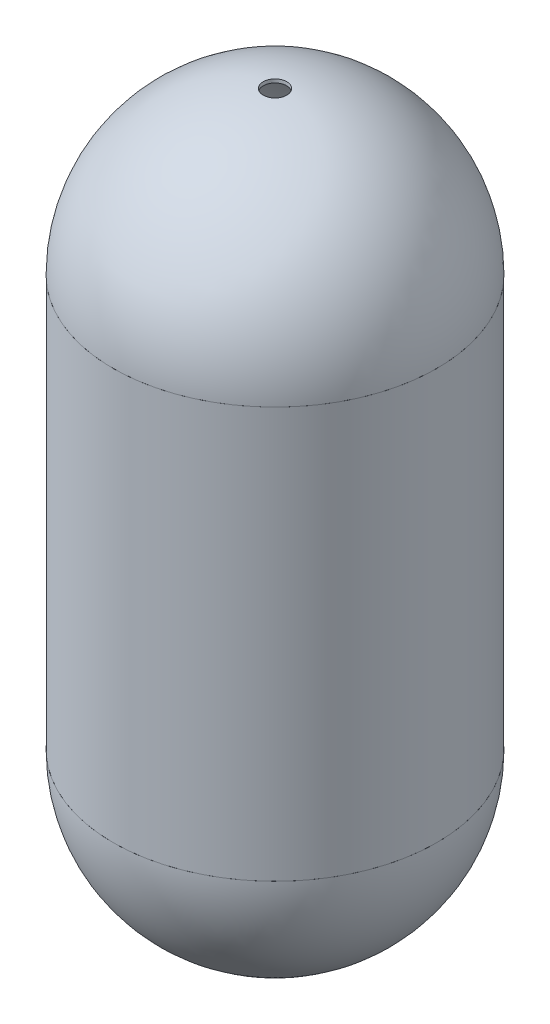
ISO-10303-21;
HEADER;
FILE_DESCRIPTION(('STEP AP214'),'2;1');
FILE_NAME('part.step','',(''),(''),'','','');
FILE_SCHEMA(('AUTOMOTIVE_DESIGN { 1 0 10303 214 1 1 1 1 }'));
ENDSEC;
DATA;
#1=APPLICATION_CONTEXT('core data for automotive mechanical design processes');
#2=APPLICATION_PROTOCOL_DEFINITION('international standard','automotive_design',2000,#1);
#3=PRODUCT_CONTEXT('',#1,'mechanical');
#4=PRODUCT('Part','Part','',(#3));
#5=PRODUCT_RELATED_PRODUCT_CATEGORY('part','',(#4));
#6=PRODUCT_DEFINITION_FORMATION('','',#4);
#7=PRODUCT_DEFINITION_CONTEXT('part definition',#1,'design');
#8=PRODUCT_DEFINITION('design','',#6,#7);
#9=PRODUCT_DEFINITION_SHAPE('','',#8);
#10=(LENGTH_UNIT() NAMED_UNIT(*) SI_UNIT(.MILLI.,.METRE.));
#11=(NAMED_UNIT(*) PLANE_ANGLE_UNIT() SI_UNIT($,.RADIAN.));
#12=(NAMED_UNIT(*) SI_UNIT($,.STERADIAN.) SOLID_ANGLE_UNIT());
#13=UNCERTAINTY_MEASURE_WITH_UNIT(LENGTH_MEASURE(1.E-05),#10,'distance_accuracy_value','');
#14=(GEOMETRIC_REPRESENTATION_CONTEXT(3) GLOBAL_UNCERTAINTY_ASSIGNED_CONTEXT((#13)) GLOBAL_UNIT_ASSIGNED_CONTEXT((#10,
#11,#12)) REPRESENTATION_CONTEXT('',''));
#15=CARTESIAN_POINT('',(0.,0.,0.));
#16=DIRECTION('',(0.,0.,1.));
#17=DIRECTION('',(1.,0.,0.));
#18=AXIS2_PLACEMENT_3D('',#15,#16,#17);
#19=CARTESIAN_POINT('',(0.,656.25,0.));
#20=DIRECTION('',(-0.87529345214149,0.,-0.483592155269533));
#21=DIRECTION('',(0.483592155269533,0.,-0.875293452141491));
#22=AXIS2_PLACEMENT_3D('',#19,#20,#21);
#23=SPHERICAL_SURFACE('',#22,517.5);
#24=CARTESIAN_POINT('',(0.,656.25,0.));
#25=DIRECTION('',(0.,-1.,0.));
#26=DIRECTION('',(-0.483592155269534,0.,0.87529345214149));
#27=AXIS2_PLACEMENT_3D('',#24,#25,#26);
#28=SPHERICAL_SURFACE('',#27,517.5);
#29=CARTESIAN_POINT('',(1.83809291443164E-12,1172.38951602256,-3.33908867480559E-12));
#30=DIRECTION('',(0.,-1.,0.));
#31=DIRECTION('',(-0.483592155269534,0.,0.87529345214149));
#32=AXIS2_PLACEMENT_3D('',#29,#30,#31);
#33=CIRCLE('',#32,37.5);
#34=CARTESIAN_POINT('',(18.1347058226093,1172.38951602256,-32.8235044553092));
#35=VERTEX_POINT('',#34);
#36=EDGE_CURVE('E60',#35,#35,#33,.T.);
#37=ORIENTED_EDGE('',*,*,#36,.T.);
#38=EDGE_LOOP('',(#37));
#39=FACE_BOUND('',#38,.T.);
#40=CARTESIAN_POINT('',(0.,656.25,0.));
#41=DIRECTION('',(0.,-1.,0.));
#42=DIRECTION('',(-0.483592155269533,0.,0.875293452141491));
#43=AXIS2_PLACEMENT_3D('',#40,#41,#42);
#44=CIRCLE('',#43,517.5);
#45=CARTESIAN_POINT('',(-250.258940351983,656.25,452.964361483221));
#46=VERTEX_POINT('',#45);
#47=EDGE_CURVE('E56',#46,#46,#44,.T.);
#48=ORIENTED_EDGE('',*,*,#47,.F.);
#49=EDGE_LOOP('',(#48));
#50=FACE_BOUND('',#49,.T.);
#51=ADVANCED_FACE('F48',(#39,#50),#28,.T.);
#52=CARTESIAN_POINT('',(0.,656.25,0.));
#53=DIRECTION('',(-0.87529345214149,0.,-0.483592155269533));
#54=DIRECTION('',(0.483592155269533,0.,-0.875293452141491));
#55=AXIS2_PLACEMENT_3D('',#52,#53,#54);
#56=SPHERICAL_SURFACE('',#55,506.25);
#57=CARTESIAN_POINT('',(0.,656.25,0.));
#58=DIRECTION('',(0.,-1.,0.));
#59=DIRECTION('',(-0.483592155269534,0.,0.87529345214149));
#60=AXIS2_PLACEMENT_3D('',#57,#58,#59);
#61=SPHERICAL_SURFACE('',#60,506.25);
#62=CARTESIAN_POINT('',(1.8000542477594E-12,1161.10920066886,-3.2702085127367E-12));
#63=DIRECTION('',(0.,-1.,0.));
#64=DIRECTION('',(-0.483592155269534,0.,0.87529345214149));
#65=AXIS2_PLACEMENT_3D('',#62,#63,#64);
#66=CIRCLE('',#65,37.5);
#67=CARTESIAN_POINT('',(18.1347058226093,1161.10920066886,-32.8235044553092));
#68=VERTEX_POINT('',#67);
#69=EDGE_CURVE('E52',#68,#68,#66,.F.);
#70=ORIENTED_EDGE('',*,*,#69,.T.);
#71=EDGE_LOOP('',(#70));
#72=FACE_BOUND('',#71,.T.);
#73=CARTESIAN_POINT('',(0.,656.25,0.));
#74=DIRECTION('',(0.,1.,0.));
#75=DIRECTION('',(-0.483592155269533,0.,0.875293452141491));
#76=AXIS2_PLACEMENT_3D('',#73,#74,#75);
#77=CIRCLE('',#76,506.25);
#78=CARTESIAN_POINT('',(-244.818528605201,656.25,443.11731014663));
#79=VERTEX_POINT('',#78);
#80=EDGE_CURVE('E11',#79,#79,#77,.T.);
#81=ORIENTED_EDGE('',*,*,#80,.F.);
#82=EDGE_LOOP('',(#81));
#83=FACE_BOUND('',#82,.T.);
#84=ADVANCED_FACE('F50',(#72,#83),#61,.F.);
#85=CARTESIAN_POINT('',(0.,656.25,0.));
#86=DIRECTION('',(0.,-1.,0.));
#87=DIRECTION('',(-0.483592155269533,0.,0.875293452141491));
#88=AXIS2_PLACEMENT_3D('',#85,#86,#87);
#89=PLANE('',#88);
#90=ORIENTED_EDGE('',*,*,#80,.T.);
#91=EDGE_LOOP('',(#90));
#92=FACE_BOUND('',#91,.T.);
#93=ORIENTED_EDGE('',*,*,#47,.T.);
#94=EDGE_LOOP('',(#93));
#95=FACE_BOUND('',#94,.T.);
#96=ADVANCED_FACE('F74',(#92,#95),#89,.T.);
#97=CARTESIAN_POINT('',(0.,656.249991,-1.87423759510345E-13));
#98=DIRECTION('',(0.,1.,0.));
#99=DIRECTION('',(0.483592155269534,0.,-0.87529345214149));
#100=AXIS2_PLACEMENT_3D('',#97,#98,#99);
#101=CYLINDRICAL_SURFACE('',#100,37.5);
#102=CARTESIAN_POINT('',(18.1347058226093,1161.10920066886,-32.8235044553092));
#103=CARTESIAN_POINT('',(18.1347058226093,1161.22670395379,-32.8235044553092));
#104=CARTESIAN_POINT('',(18.1347058226093,1161.34420723873,-32.8235044553092));
#105=CARTESIAN_POINT('',(18.1347058226093,1161.5792138086,-32.8235044553092));
#106=CARTESIAN_POINT('',(18.1347058226093,1161.69671709353,-32.8235044553092));
#107=CARTESIAN_POINT('',(18.1347058226093,1161.9317236634,-32.8235044553092));
#108=CARTESIAN_POINT('',(18.1347058226093,1162.04922694833,-32.8235044553092));
#109=CARTESIAN_POINT('',(18.1347058226093,1162.2842335182,-32.8235044553092));
#110=CARTESIAN_POINT('',(18.1347058226093,1162.40173680314,-32.8235044553092));
#111=CARTESIAN_POINT('',(18.1347058226093,1162.63674337301,-32.8235044553092));
#112=CARTESIAN_POINT('',(18.1347058226093,1162.75424665794,-32.8235044553092));
#113=CARTESIAN_POINT('',(18.1347058226093,1162.98925322781,-32.8235044553092));
#114=CARTESIAN_POINT('',(18.1347058226093,1163.10675651274,-32.8235044553092));
#115=CARTESIAN_POINT('',(18.1347058226093,1163.34176308261,-32.8235044553092));
#116=CARTESIAN_POINT('',(18.1347058226093,1163.45926636755,-32.8235044553092));
#117=CARTESIAN_POINT('',(18.1347058226093,1163.69427293742,-32.8235044553092));
#118=CARTESIAN_POINT('',(18.1347058226093,1163.81177622235,-32.8235044553092));
#119=CARTESIAN_POINT('',(18.1347058226093,1164.04678279222,-32.8235044553092));
#120=CARTESIAN_POINT('',(18.1347058226093,1164.16428607715,-32.8235044553092));
#121=CARTESIAN_POINT('',(18.1347058226093,1164.39929264702,-32.8235044553092));
#122=CARTESIAN_POINT('',(18.1347058226093,1164.51679593196,-32.8235044553092));
#123=CARTESIAN_POINT('',(18.1347058226093,1164.75180250182,-32.8235044553092));
#124=CARTESIAN_POINT('',(18.1347058226093,1164.86930578676,-32.8235044553092));
#125=CARTESIAN_POINT('',(18.1347058226093,1165.10431235663,-32.8235044553092));
#126=CARTESIAN_POINT('',(18.1347058226093,1165.22181564156,-32.8235044553092));
#127=CARTESIAN_POINT('',(18.1347058226093,1165.45682221143,-32.8235044553092));
#128=CARTESIAN_POINT('',(18.1347058226093,1165.57432549637,-32.8235044553092));
#129=CARTESIAN_POINT('',(18.1347058226093,1165.80933206623,-32.8235044553092));
#130=CARTESIAN_POINT('',(18.1347058226093,1165.92683535117,-32.8235044553092));
#131=CARTESIAN_POINT('',(18.1347058226093,1166.16184192104,-32.8235044553092));
#132=CARTESIAN_POINT('',(18.1347058226093,1166.27934520597,-32.8235044553092));
#133=CARTESIAN_POINT('',(18.1347058226093,1166.51435177584,-32.8235044553092));
#134=CARTESIAN_POINT('',(18.1347058226093,1166.63185506077,-32.8235044553092));
#135=CARTESIAN_POINT('',(18.1347058226093,1166.86686163064,-32.8235044553092));
#136=CARTESIAN_POINT('',(18.1347058226093,1166.98436491558,-32.8235044553092));
#137=CARTESIAN_POINT('',(18.1347058226093,1167.21937148545,-32.8235044553092));
#138=CARTESIAN_POINT('',(18.1347058226093,1167.33687477038,-32.8235044553092));
#139=CARTESIAN_POINT('',(18.1347058226093,1167.57188134025,-32.8235044553092));
#140=CARTESIAN_POINT('',(18.1347058226093,1167.68938462518,-32.8235044553092));
#141=CARTESIAN_POINT('',(18.1347058226093,1167.92439119505,-32.8235044553092));
#142=CARTESIAN_POINT('',(18.1347058226093,1168.04189447999,-32.8235044553092));
#143=CARTESIAN_POINT('',(18.1347058226093,1168.27690104986,-32.8235044553092));
#144=CARTESIAN_POINT('',(18.1347058226093,1168.39440433479,-32.8235044553092));
#145=CARTESIAN_POINT('',(18.1347058226093,1168.62941090466,-32.8235044553092));
#146=CARTESIAN_POINT('',(18.1347058226093,1168.74691418959,-32.8235044553092));
#147=CARTESIAN_POINT('',(18.1347058226093,1168.98192075946,-32.8235044553092));
#148=CARTESIAN_POINT('',(18.1347058226093,1169.0994240444,-32.8235044553092));
#149=CARTESIAN_POINT('',(18.1347058226093,1169.33443061426,-32.8235044553092));
#150=CARTESIAN_POINT('',(18.1347058226093,1169.4519338992,-32.8235044553092));
#151=CARTESIAN_POINT('',(18.1347058226093,1169.68694046907,-32.8235044553092));
#152=CARTESIAN_POINT('',(18.1347058226093,1169.804443754,-32.8235044553092));
#153=CARTESIAN_POINT('',(18.1347058226093,1170.03945032387,-32.8235044553092));
#154=CARTESIAN_POINT('',(18.1347058226093,1170.1569536088,-32.8235044553092));
#155=CARTESIAN_POINT('',(18.1347058226093,1170.39196017867,-32.8235044553092));
#156=CARTESIAN_POINT('',(18.1347058226093,1170.50946346361,-32.8235044553092));
#157=CARTESIAN_POINT('',(18.1347058226093,1170.74447003348,-32.8235044553092));
#158=CARTESIAN_POINT('',(18.1347058226093,1170.86197331841,-32.8235044553092));
#159=CARTESIAN_POINT('',(18.1347058226093,1171.09697988828,-32.8235044553092));
#160=CARTESIAN_POINT('',(18.1347058226093,1171.21448317321,-32.8235044553092));
#161=CARTESIAN_POINT('',(18.1347058226093,1171.44948974308,-32.8235044553092));
#162=CARTESIAN_POINT('',(18.1347058226093,1171.56699302802,-32.8235044553092));
#163=CARTESIAN_POINT('',(18.1347058226093,1171.80199959789,-32.8235044553092));
#164=CARTESIAN_POINT('',(18.1347058226093,1171.91950288282,-32.8235044553092));
#165=CARTESIAN_POINT('',(18.1347058226093,1172.15450945269,-32.8235044553092));
#166=CARTESIAN_POINT('',(18.1347058226093,1172.27201273762,-32.8235044553092));
#167=CARTESIAN_POINT('',(18.1347058226093,1172.38951602256,-32.8235044553092));
#168=B_SPLINE_CURVE_WITH_KNOTS('',3,(#102,#103,#104,#105,#106,#107,#108,#109,#110,#111,#112,
#113,#114,#115,#116,#117,#118,#119,#120,#121,#122,#123,#124,#125,#126,#127,#128,#129,#130,#131,
#132,#133,#134,#135,#136,#137,#138,#139,#140,#141,#142,#143,#144,#145,#146,#147,#148,#149,#150,
#151,#152,#153,#154,#155,#156,#157,#158,#159,#160,#161,#162,#163,#164,#165,#166,#167),
.UNSPECIFIED.,.F.,.F.,(4,2,2,2,2,2,2,2,2,2,2,2,2,2,2,2,2,2,2,2,2,2,2,2,2,2,2,2,2,2,2,2,4),(0.,
0.352509854802951,0.705019709606125,1.0575295644093,1.41003941921225,1.7625492740152,
2.11505912881838,2.46756898362133,2.82007883842428,3.17258869322745,3.52509854803063,
3.87760840283358,4.23011825763653,4.5826281124397,4.93513796724265,5.2876478220456,
5.64015767684878,5.99266753165195,6.3451773864549,6.69768724125785,7.05019709606103,
7.40270695086398,7.75521680566693,8.1077266604701,8.46023651527328,8.81274637007623,
9.16525622487918,9.51776607968235,9.87027593448531,10.2227857892883,10.5752956440914,
10.9278054988946,11.2803153536976),.UNSPECIFIED.);
#169=EDGE_CURVE('BSEAM71',#68,#35,#168,.T.);
#170=ORIENTED_EDGE('',*,*,#69,.F.);
#171=ORIENTED_EDGE('',*,*,#36,.F.);
#172=ORIENTED_EDGE('',*,*,#169,.T.);
#173=ORIENTED_EDGE('',*,*,#169,.F.);
#174=EDGE_LOOP('',(#170,#172,#171,#173));
#175=FACE_BOUND('',#174,.T.);
#176=ADVANCED_FACE('F71',(#175),#101,.F.);
#177=CLOSED_SHELL('',(#51,#84,#96,#176));
#178=MANIFOLD_SOLID_BREP('B2',#177);
#179=CARTESIAN_POINT('',(0.,-656.25,0.));
#180=DIRECTION('',(-0.145123773166015,0.,0.98941350832807));
#181=DIRECTION('',(0.98941350832807,0.,0.145123773166015));
#182=AXIS2_PLACEMENT_3D('',#179,#180,#181);
#183=SPHERICAL_SURFACE('',#182,517.5);
#184=CARTESIAN_POINT('',(0.,-656.25,0.));
#185=DIRECTION('',(0.,1.,0.));
#186=DIRECTION('',(-0.98941350832807,0.,-0.145123773166014));
#187=AXIS2_PLACEMENT_3D('',#184,#185,#186);
#188=SPHERICAL_SURFACE('',#187,517.5);
#189=CARTESIAN_POINT('',(3.77324272926284E-12,-1172.38951602256,5.59144233357373E-13));
#190=DIRECTION('',(0.,1.,0.));
#191=DIRECTION('',(-0.98941350832807,0.,-0.145123773166014));
#192=AXIS2_PLACEMENT_3D('',#189,#190,#191);
#193=CIRCLE('',#192,37.5);
#194=CARTESIAN_POINT('',(37.1030065623064,-1172.38951602256,5.4421414937261));
#195=VERTEX_POINT('',#194);
#196=EDGE_CURVE('E137',#195,#195,#193,.T.);
#197=ORIENTED_EDGE('',*,*,#196,.T.);
#198=EDGE_LOOP('',(#197));
#199=FACE_BOUND('',#198,.T.);
#200=CARTESIAN_POINT('',(0.,-656.25,0.));
#201=DIRECTION('',(0.,1.,0.));
#202=DIRECTION('',(-0.98941350832807,0.,-0.145123773166015));
#203=AXIS2_PLACEMENT_3D('',#200,#201,#202);
#204=CIRCLE('',#203,517.5);
#205=CARTESIAN_POINT('',(-512.021490559776,-656.25,-75.1015526134127));
#206=VERTEX_POINT('',#205);
#207=EDGE_CURVE('E133',#206,#206,#204,.T.);
#208=ORIENTED_EDGE('',*,*,#207,.F.);
#209=EDGE_LOOP('',(#208));
#210=FACE_BOUND('',#209,.T.);
#211=ADVANCED_FACE('F125',(#199,#210),#188,.T.);
#212=CARTESIAN_POINT('',(0.,-656.25,0.));
#213=DIRECTION('',(-0.145123773166015,0.,0.98941350832807));
#214=DIRECTION('',(0.98941350832807,0.,0.145123773166015));
#215=AXIS2_PLACEMENT_3D('',#212,#213,#214);
#216=SPHERICAL_SURFACE('',#215,506.25);
#217=CARTESIAN_POINT('',(0.,-656.25,0.));
#218=DIRECTION('',(0.,1.,0.));
#219=DIRECTION('',(-0.98941350832807,0.,-0.145123773166014));
#220=AXIS2_PLACEMENT_3D('',#217,#218,#219);
#221=SPHERICAL_SURFACE('',#220,506.25);
#222=CARTESIAN_POINT('',(3.69532943417054E-12,-1161.10920066886,5.47706604172922E-13));
#223=DIRECTION('',(0.,1.,0.));
#224=DIRECTION('',(-0.98941350832807,0.,-0.145123773166014));
#225=AXIS2_PLACEMENT_3D('',#222,#223,#224);
#226=CIRCLE('',#225,37.5);
#227=CARTESIAN_POINT('',(37.1030065623063,-1161.10920066886,5.44214149372609));
#228=VERTEX_POINT('',#227);
#229=EDGE_CURVE('E129',#228,#228,#226,.F.);
#230=ORIENTED_EDGE('',*,*,#229,.T.);
#231=EDGE_LOOP('',(#230));
#232=FACE_BOUND('',#231,.T.);
#233=CARTESIAN_POINT('',(0.,-656.25,0.));
#234=DIRECTION('',(0.,-1.,0.));
#235=DIRECTION('',(-0.98941350832807,0.,-0.145123773166015));
#236=AXIS2_PLACEMENT_3D('',#233,#234,#235);
#237=CIRCLE('',#236,506.25);
#238=CARTESIAN_POINT('',(-500.890588591085,-656.25,-73.468910165295));
#239=VERTEX_POINT('',#238);
#240=EDGE_CURVE('E47',#239,#239,#237,.T.);
#241=ORIENTED_EDGE('',*,*,#240,.F.);
#242=EDGE_LOOP('',(#241));
#243=FACE_BOUND('',#242,.T.);
#244=ADVANCED_FACE('F127',(#232,#243),#221,.F.);
#245=CARTESIAN_POINT('',(0.,-656.25,0.));
#246=DIRECTION('',(0.,1.,0.));
#247=DIRECTION('',(-0.98941350832807,0.,-0.145123773166015));
#248=AXIS2_PLACEMENT_3D('',#245,#246,#247);
#249=PLANE('',#248);
#250=ORIENTED_EDGE('',*,*,#240,.T.);
#251=EDGE_LOOP('',(#250));
#252=FACE_BOUND('',#251,.T.);
#253=ORIENTED_EDGE('',*,*,#207,.T.);
#254=EDGE_LOOP('',(#253));
#255=FACE_BOUND('',#254,.T.);
#256=ADVANCED_FACE('F151',(#252,#255),#249,.T.);
#257=CARTESIAN_POINT('',(2.08259848824405E-13,-656.249991,0.));
#258=DIRECTION('',(0.,-1.,0.));
#259=DIRECTION('',(0.98941350832807,0.,0.145123773166014));
#260=AXIS2_PLACEMENT_3D('',#257,#258,#259);
#261=CYLINDRICAL_SURFACE('',#260,37.5);
#262=CARTESIAN_POINT('',(37.1030065623063,-1161.10920066886,5.44214149372609));
#263=CARTESIAN_POINT('',(37.1030065623063,-1161.22670395379,5.44214149372609));
#264=CARTESIAN_POINT('',(37.1030065623063,-1161.34420723873,5.44214149372609));
#265=CARTESIAN_POINT('',(37.1030065623063,-1161.5792138086,5.44214149372609));
#266=CARTESIAN_POINT('',(37.1030065623063,-1161.69671709353,5.44214149372609));
#267=CARTESIAN_POINT('',(37.1030065623063,-1161.9317236634,5.44214149372609));
#268=CARTESIAN_POINT('',(37.1030065623063,-1162.04922694833,5.44214149372609));
#269=CARTESIAN_POINT('',(37.1030065623063,-1162.2842335182,5.44214149372609));
#270=CARTESIAN_POINT('',(37.1030065623063,-1162.40173680314,5.44214149372609));
#271=CARTESIAN_POINT('',(37.1030065623063,-1162.63674337301,5.44214149372609));
#272=CARTESIAN_POINT('',(37.1030065623063,-1162.75424665794,5.44214149372609));
#273=CARTESIAN_POINT('',(37.1030065623063,-1162.98925322781,5.44214149372609));
#274=CARTESIAN_POINT('',(37.1030065623063,-1163.10675651274,5.44214149372609));
#275=CARTESIAN_POINT('',(37.1030065623063,-1163.34176308261,5.44214149372609));
#276=CARTESIAN_POINT('',(37.1030065623063,-1163.45926636755,5.44214149372609));
#277=CARTESIAN_POINT('',(37.1030065623063,-1163.69427293742,5.44214149372609));
#278=CARTESIAN_POINT('',(37.1030065623063,-1163.81177622235,5.44214149372609));
#279=CARTESIAN_POINT('',(37.1030065623063,-1164.04678279222,5.44214149372609));
#280=CARTESIAN_POINT('',(37.1030065623063,-1164.16428607715,5.44214149372609));
#281=CARTESIAN_POINT('',(37.1030065623063,-1164.39929264702,5.44214149372609));
#282=CARTESIAN_POINT('',(37.1030065623063,-1164.51679593196,5.44214149372609));
#283=CARTESIAN_POINT('',(37.1030065623063,-1164.75180250182,5.44214149372609));
#284=CARTESIAN_POINT('',(37.1030065623063,-1164.86930578676,5.4421414937261));
#285=CARTESIAN_POINT('',(37.1030065623063,-1165.10431235663,5.4421414937261));
#286=CARTESIAN_POINT('',(37.1030065623063,-1165.22181564156,5.4421414937261));
#287=CARTESIAN_POINT('',(37.1030065623063,-1165.45682221143,5.4421414937261));
#288=CARTESIAN_POINT('',(37.1030065623063,-1165.57432549636,5.4421414937261));
#289=CARTESIAN_POINT('',(37.1030065623063,-1165.80933206623,5.4421414937261));
#290=CARTESIAN_POINT('',(37.1030065623063,-1165.92683535117,5.4421414937261));
#291=CARTESIAN_POINT('',(37.1030065623063,-1166.16184192104,5.4421414937261));
#292=CARTESIAN_POINT('',(37.1030065623064,-1166.27934520597,5.4421414937261));
#293=CARTESIAN_POINT('',(37.1030065623064,-1166.51435177584,5.4421414937261));
#294=CARTESIAN_POINT('',(37.1030065623064,-1166.63185506077,5.4421414937261));
#295=CARTESIAN_POINT('',(37.1030065623064,-1166.86686163064,5.4421414937261));
#296=CARTESIAN_POINT('',(37.1030065623064,-1166.98436491558,5.4421414937261));
#297=CARTESIAN_POINT('',(37.1030065623064,-1167.21937148545,5.4421414937261));
#298=CARTESIAN_POINT('',(37.1030065623064,-1167.33687477038,5.4421414937261));
#299=CARTESIAN_POINT('',(37.1030065623064,-1167.57188134025,5.4421414937261));
#300=CARTESIAN_POINT('',(37.1030065623064,-1167.68938462518,5.4421414937261));
#301=CARTESIAN_POINT('',(37.1030065623064,-1167.92439119505,5.4421414937261));
#302=CARTESIAN_POINT('',(37.1030065623064,-1168.04189447999,5.4421414937261));
#303=CARTESIAN_POINT('',(37.1030065623064,-1168.27690104985,5.4421414937261));
#304=CARTESIAN_POINT('',(37.1030065623064,-1168.39440433479,5.4421414937261));
#305=CARTESIAN_POINT('',(37.1030065623064,-1168.62941090466,5.4421414937261));
#306=CARTESIAN_POINT('',(37.1030065623064,-1168.74691418959,5.4421414937261));
#307=CARTESIAN_POINT('',(37.1030065623064,-1168.98192075946,5.4421414937261));
#308=CARTESIAN_POINT('',(37.1030065623064,-1169.0994240444,5.4421414937261));
#309=CARTESIAN_POINT('',(37.1030065623064,-1169.33443061426,5.4421414937261));
#310=CARTESIAN_POINT('',(37.1030065623064,-1169.4519338992,5.4421414937261));
#311=CARTESIAN_POINT('',(37.1030065623064,-1169.68694046907,5.4421414937261));
#312=CARTESIAN_POINT('',(37.1030065623064,-1169.804443754,5.4421414937261));
#313=CARTESIAN_POINT('',(37.1030065623064,-1170.03945032387,5.4421414937261));
#314=CARTESIAN_POINT('',(37.1030065623064,-1170.1569536088,5.4421414937261));
#315=CARTESIAN_POINT('',(37.1030065623064,-1170.39196017867,5.4421414937261));
#316=CARTESIAN_POINT('',(37.1030065623064,-1170.50946346361,5.4421414937261));
#317=CARTESIAN_POINT('',(37.1030065623064,-1170.74447003348,5.4421414937261));
#318=CARTESIAN_POINT('',(37.1030065623064,-1170.86197331841,5.4421414937261));
#319=CARTESIAN_POINT('',(37.1030065623064,-1171.09697988828,5.4421414937261));
#320=CARTESIAN_POINT('',(37.1030065623064,-1171.21448317321,5.4421414937261));
#321=CARTESIAN_POINT('',(37.1030065623064,-1171.44948974308,5.4421414937261));
#322=CARTESIAN_POINT('',(37.1030065623064,-1171.56699302802,5.4421414937261));
#323=CARTESIAN_POINT('',(37.1030065623064,-1171.80199959789,5.4421414937261));
#324=CARTESIAN_POINT('',(37.1030065623064,-1171.91950288282,5.4421414937261));
#325=CARTESIAN_POINT('',(37.1030065623064,-1172.15450945269,5.4421414937261));
#326=CARTESIAN_POINT('',(37.1030065623064,-1172.27201273762,5.4421414937261));
#327=CARTESIAN_POINT('',(37.1030065623064,-1172.38951602256,5.4421414937261));
#328=B_SPLINE_CURVE_WITH_KNOTS('',3,(#262,#263,#264,#265,#266,#267,#268,#269,#270,#271,#272,
#273,#274,#275,#276,#277,#278,#279,#280,#281,#282,#283,#284,#285,#286,#287,#288,#289,#290,#291,
#292,#293,#294,#295,#296,#297,#298,#299,#300,#301,#302,#303,#304,#305,#306,#307,#308,#309,#310,
#311,#312,#313,#314,#315,#316,#317,#318,#319,#320,#321,#322,#323,#324,#325,#326,#327),
.UNSPECIFIED.,.F.,.F.,(4,2,2,2,2,2,2,2,2,2,2,2,2,2,2,2,2,2,2,2,2,2,2,2,2,2,2,2,2,2,2,2,4),(0.,
0.352509854802951,0.705019709606125,1.0575295644093,1.41003941921225,1.7625492740152,
2.11505912881838,2.46756898362155,2.8200788384245,3.17258869322745,3.52509854803063,
3.8776084028338,4.23011825763675,4.5826281124397,4.93513796724288,5.28764782204605,
5.640157676849,5.99266753165195,6.34517738645513,6.6976872412583,7.05019709606125,
7.4027069508642,7.75521680566738,8.10772666047055,8.4602365152735,8.81274637007645,
9.16525622487963,9.5177660796828,9.87027593448575,10.2227857892887,10.5752956440919,
10.927805498895,11.280315353698),.UNSPECIFIED.);
#329=EDGE_CURVE('BSEAM148',#228,#195,#328,.T.);
#330=ORIENTED_EDGE('',*,*,#229,.F.);
#331=ORIENTED_EDGE('',*,*,#196,.F.);
#332=ORIENTED_EDGE('',*,*,#329,.T.);
#333=ORIENTED_EDGE('',*,*,#329,.F.);
#334=EDGE_LOOP('',(#330,#332,#331,#333));
#335=FACE_BOUND('',#334,.T.);
#336=ADVANCED_FACE('F148',(#335),#261,.F.);
#337=CLOSED_SHELL('',(#211,#244,#256,#336));
#338=MANIFOLD_SOLID_BREP('B6',#337);
#339=CARTESIAN_POINT('',(0.,656.25,0.));
#340=DIRECTION('',(0.,-1.,0.));
#341=DIRECTION('',(0.,0.,-1.));
#342=AXIS2_PLACEMENT_3D('',#339,#340,#341);
#343=CYLINDRICAL_SURFACE('',#342,517.5);
#344=CARTESIAN_POINT('',(0.,656.25,0.));
#345=DIRECTION('',(0.,1.,0.));
#346=DIRECTION('',(0.,0.,1.));
#347=AXIS2_PLACEMENT_3D('',#344,#345,#346);
#348=CIRCLE('',#347,517.5);
#349=CARTESIAN_POINT('',(0.,656.25,517.5));
#350=VERTEX_POINT('',#349);
#351=EDGE_CURVE('E124',#350,#350,#348,.T.);
#352=ORIENTED_EDGE('',*,*,#351,.F.);
#353=EDGE_LOOP('',(#352));
#354=FACE_BOUND('',#353,.T.);
#355=CARTESIAN_POINT('',(0.,-656.25,0.));
#356=DIRECTION('',(0.,1.,0.));
#357=DIRECTION('',(0.,0.,1.));
#358=AXIS2_PLACEMENT_3D('',#355,#356,#357);
#359=CIRCLE('',#358,517.5);
#360=CARTESIAN_POINT('',(0.,-656.25,517.5));
#361=VERTEX_POINT('',#360);
#362=EDGE_CURVE('E198',#361,#361,#359,.T.);
#363=ORIENTED_EDGE('',*,*,#362,.T.);
#364=EDGE_LOOP('',(#363));
#365=FACE_BOUND('',#364,.T.);
#366=ADVANCED_FACE('F195',(#354,#365),#343,.T.);
#367=CARTESIAN_POINT('',(0.,656.25,0.));
#368=DIRECTION('',(0.,1.,0.));
#369=DIRECTION('',(0.,0.,1.));
#370=AXIS2_PLACEMENT_3D('',#367,#368,#369);
#371=PLANE('',#370);
#372=CARTESIAN_POINT('',(0.,656.25,0.));
#373=DIRECTION('',(0.,1.,0.));
#374=DIRECTION('',(0.,0.,1.));
#375=AXIS2_PLACEMENT_3D('',#372,#373,#374);
#376=CIRCLE('',#375,506.25);
#377=CARTESIAN_POINT('',(0.,656.25,506.25));
#378=VERTEX_POINT('',#377);
#379=EDGE_CURVE('E209',#378,#378,#376,.T.);
#380=ORIENTED_EDGE('',*,*,#379,.F.);
#381=EDGE_LOOP('',(#380));
#382=FACE_BOUND('',#381,.T.);
#383=ORIENTED_EDGE('',*,*,#351,.T.);
#384=EDGE_LOOP('',(#383));
#385=FACE_BOUND('',#384,.T.);
#386=ADVANCED_FACE('F215',(#382,#385),#371,.T.);
#387=CARTESIAN_POINT('',(0.,-656.25,0.));
#388=DIRECTION('',(0.,1.,0.));
#389=DIRECTION('',(0.,0.,1.));
#390=AXIS2_PLACEMENT_3D('',#387,#388,#389);
#391=PLANE('',#390);
#392=CARTESIAN_POINT('',(0.,-656.25,0.));
#393=DIRECTION('',(0.,1.,0.));
#394=DIRECTION('',(0.,0.,1.));
#395=AXIS2_PLACEMENT_3D('',#392,#393,#394);
#396=CIRCLE('',#395,506.25);
#397=CARTESIAN_POINT('',(0.,-656.25,506.25));
#398=VERTEX_POINT('',#397);
#399=EDGE_CURVE('E205',#398,#398,#396,.T.);
#400=ORIENTED_EDGE('',*,*,#399,.T.);
#401=EDGE_LOOP('',(#400));
#402=FACE_BOUND('',#401,.T.);
#403=ORIENTED_EDGE('',*,*,#362,.F.);
#404=EDGE_LOOP('',(#403));
#405=FACE_BOUND('',#404,.T.);
#406=ADVANCED_FACE('F217',(#402,#405),#391,.F.);
#407=CARTESIAN_POINT('',(0.,-656.25,0.));
#408=DIRECTION('',(0.,1.,0.));
#409=DIRECTION('',(0.,0.,1.));
#410=AXIS2_PLACEMENT_3D('',#407,#408,#409);
#411=CYLINDRICAL_SURFACE('',#410,506.25);
#412=ORIENTED_EDGE('',*,*,#399,.F.);
#413=EDGE_LOOP('',(#412));
#414=FACE_BOUND('',#413,.T.);
#415=ORIENTED_EDGE('',*,*,#379,.T.);
#416=EDGE_LOOP('',(#415));
#417=FACE_BOUND('',#416,.T.);
#418=ADVANCED_FACE('F213',(#414,#417),#411,.F.);
#419=CLOSED_SHELL('',(#366,#386,#406,#418));
#420=MANIFOLD_SOLID_BREP('B42',#419);
#421=ADVANCED_BREP_SHAPE_REPRESENTATION('',(#18,#178,#338,#420),#14);
#422=SHAPE_DEFINITION_REPRESENTATION(#9,#421);
ENDSEC;
END-ISO-10303-21;
